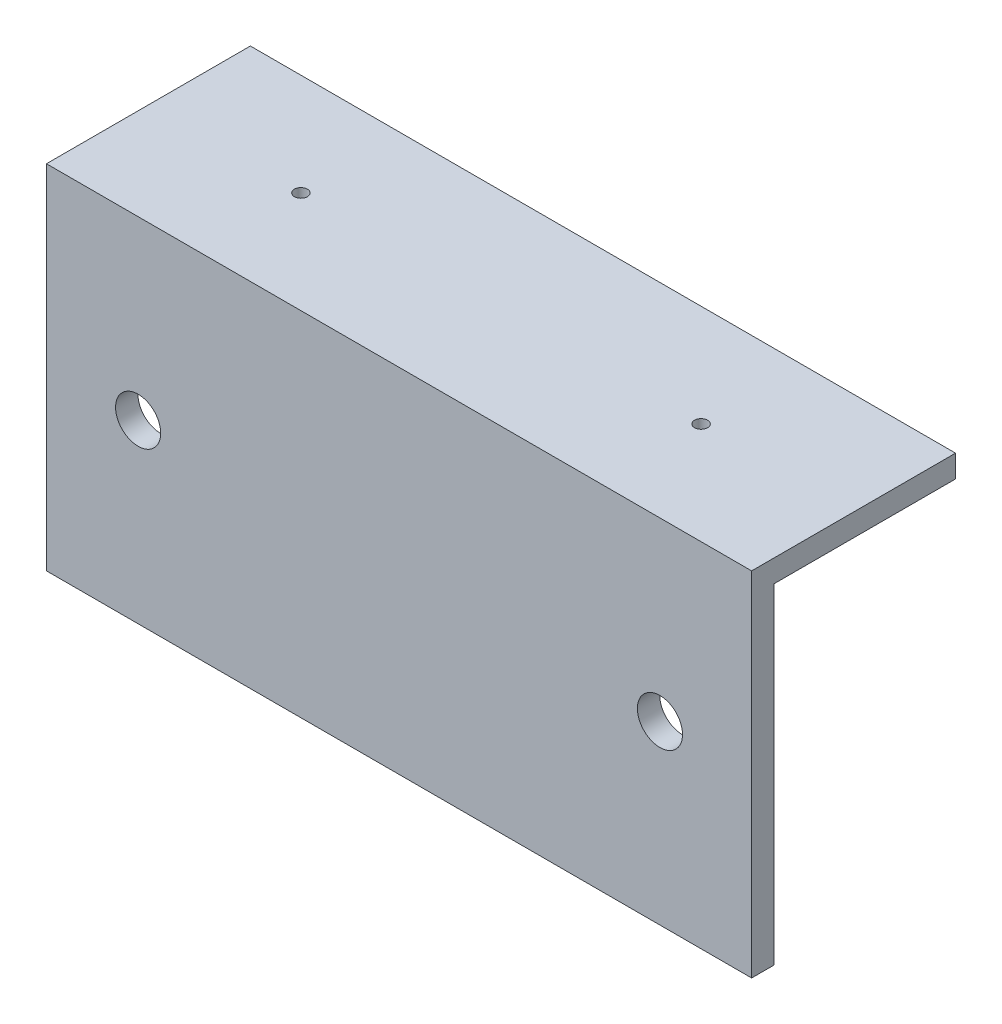
ISO-10303-21;
HEADER;
FILE_DESCRIPTION(('STEP AP214'),'2;1');
FILE_NAME('part.step','',(''),(''),'','','');
FILE_SCHEMA(('AUTOMOTIVE_DESIGN { 1 0 10303 214 1 1 1 1 }'));
ENDSEC;
DATA;
#1=APPLICATION_CONTEXT('core data for automotive mechanical design processes');
#2=APPLICATION_PROTOCOL_DEFINITION('international standard','automotive_design',2000,#1);
#3=PRODUCT_CONTEXT('',#1,'mechanical');
#4=PRODUCT('Part','Part','',(#3));
#5=PRODUCT_RELATED_PRODUCT_CATEGORY('part','',(#4));
#6=PRODUCT_DEFINITION_FORMATION('','',#4);
#7=PRODUCT_DEFINITION_CONTEXT('part definition',#1,'design');
#8=PRODUCT_DEFINITION('design','',#6,#7);
#9=PRODUCT_DEFINITION_SHAPE('','',#8);
#10=(LENGTH_UNIT() NAMED_UNIT(*) SI_UNIT(.MILLI.,.METRE.));
#11=(NAMED_UNIT(*) PLANE_ANGLE_UNIT() SI_UNIT($,.RADIAN.));
#12=(NAMED_UNIT(*) SI_UNIT($,.STERADIAN.) SOLID_ANGLE_UNIT());
#13=UNCERTAINTY_MEASURE_WITH_UNIT(LENGTH_MEASURE(1.E-05),#10,'distance_accuracy_value','');
#14=(GEOMETRIC_REPRESENTATION_CONTEXT(3) GLOBAL_UNCERTAINTY_ASSIGNED_CONTEXT((#13)) GLOBAL_UNIT_ASSIGNED_CONTEXT((#10,
#11,#12)) REPRESENTATION_CONTEXT('',''));
#15=CARTESIAN_POINT('',(0.,0.,0.));
#16=DIRECTION('',(0.,0.,1.));
#17=DIRECTION('',(1.,0.,0.));
#18=AXIS2_PLACEMENT_3D('',#15,#16,#17);
#19=CARTESIAN_POINT('',(25.,0.,1.5875));
#20=DIRECTION('',(-1.,0.,0.));
#21=DIRECTION('',(0.,0.,1.));
#22=AXIS2_PLACEMENT_3D('',#19,#20,#21);
#23=PLANE('',#22);
#24=DIRECTION('',(0.,1.,0.));
#25=VECTOR('',#24,1.);
#26=CARTESIAN_POINT('',(25.,0.,0.));
#27=LINE('',#26,#25);
#28=CARTESIAN_POINT('',(25.,-12.5,0.));
#29=VERTEX_POINT('',#28);
#30=CARTESIAN_POINT('',(25.,10.9125,0.));
#31=VERTEX_POINT('',#30);
#32=EDGE_CURVE('E117',#29,#31,#27,.T.);
#33=ORIENTED_EDGE('',*,*,#32,.T.);
#34=DIRECTION('',(0.,0.,-1.));
#35=VECTOR('',#34,1.);
#36=CARTESIAN_POINT('',(25.,10.9125,0.));
#37=LINE('',#36,#35);
#38=CARTESIAN_POINT('',(25.,10.9125,-12.8709783444627));
#39=VERTEX_POINT('',#38);
#40=EDGE_CURVE('E51',#31,#39,#37,.T.);
#41=ORIENTED_EDGE('',*,*,#40,.T.);
#42=DIRECTION('',(0.,1.,0.));
#43=VECTOR('',#42,1.);
#44=CARTESIAN_POINT('',(25.,10.9125,-12.8709783444627));
#45=LINE('',#44,#43);
#46=CARTESIAN_POINT('',(25.,12.5,-12.8709783444627));
#47=VERTEX_POINT('',#46);
#48=EDGE_CURVE('E100',#39,#47,#45,.T.);
#49=ORIENTED_EDGE('',*,*,#48,.T.);
#50=DIRECTION('',(0.,0.,-1.));
#51=VECTOR('',#50,1.);
#52=CARTESIAN_POINT('',(25.,12.5,1.5875));
#53=LINE('',#52,#51);
#54=CARTESIAN_POINT('',(25.,12.5,1.5875));
#55=VERTEX_POINT('',#54);
#56=EDGE_CURVE('E11',#55,#47,#53,.T.);
#57=ORIENTED_EDGE('',*,*,#56,.F.);
#58=DIRECTION('',(0.,1.,0.));
#59=VECTOR('',#58,1.);
#60=CARTESIAN_POINT('',(25.,0.,1.5875));
#61=LINE('',#60,#59);
#62=CARTESIAN_POINT('',(25.,-12.5,1.5875));
#63=VERTEX_POINT('',#62);
#64=EDGE_CURVE('E153',#63,#55,#61,.T.);
#65=ORIENTED_EDGE('',*,*,#64,.F.);
#66=DIRECTION('',(0.,0.,-1.));
#67=VECTOR('',#66,1.);
#68=CARTESIAN_POINT('',(25.,-12.5,1.5875));
#69=LINE('',#68,#67);
#70=EDGE_CURVE('E142',#63,#29,#69,.T.);
#71=ORIENTED_EDGE('',*,*,#70,.T.);
#72=EDGE_LOOP('',(#33,#41,#49,#57,#65,#71));
#73=FACE_BOUND('',#72,.T.);
#74=ADVANCED_FACE('F34',(#73),#23,.F.);
#75=CARTESIAN_POINT('',(0.,12.5,1.5875));
#76=DIRECTION('',(0.,-1.,0.));
#77=DIRECTION('',(0.,0.,-1.));
#78=AXIS2_PLACEMENT_3D('',#75,#76,#77);
#79=PLANE('',#78);
#80=CARTESIAN_POINT('',(-14.1859,12.5,-5.64173917223136));
#81=DIRECTION('',(0.,1.,0.));
#82=DIRECTION('',(0.,0.,1.));
#83=AXIS2_PLACEMENT_3D('',#80,#81,#82);
#84=CIRCLE('',#83,0.46355);
#85=CARTESIAN_POINT('',(-14.1859,12.5,-5.17818917223136));
#86=VERTEX_POINT('',#85);
#87=EDGE_CURVE('E215',#86,#86,#84,.T.);
#88=ORIENTED_EDGE('',*,*,#87,.F.);
#89=EDGE_LOOP('',(#88));
#90=FACE_BOUND('',#89,.T.);
#91=CARTESIAN_POINT('',(14.1859,12.5,-5.64173917223136));
#92=DIRECTION('',(0.,1.,0.));
#93=DIRECTION('',(0.,0.,1.));
#94=AXIS2_PLACEMENT_3D('',#91,#92,#93);
#95=CIRCLE('',#94,0.46355);
#96=CARTESIAN_POINT('',(14.1859,12.5,-5.17818917223136));
#97=VERTEX_POINT('',#96);
#98=EDGE_CURVE('E217',#97,#97,#95,.T.);
#99=ORIENTED_EDGE('',*,*,#98,.F.);
#100=EDGE_LOOP('',(#99));
#101=FACE_BOUND('',#100,.T.);
#102=ORIENTED_EDGE('',*,*,#56,.T.);
#103=DIRECTION('',(-1.,0.,0.));
#104=VECTOR('',#103,1.);
#105=CARTESIAN_POINT('',(25.,12.5,-12.8709783444627));
#106=LINE('',#105,#104);
#107=CARTESIAN_POINT('',(-25.,12.5,-12.8709783444627));
#108=VERTEX_POINT('',#107);
#109=EDGE_CURVE('E105',#47,#108,#106,.T.);
#110=ORIENTED_EDGE('',*,*,#109,.T.);
#111=DIRECTION('',(0.,0.,-1.));
#112=VECTOR('',#111,1.);
#113=CARTESIAN_POINT('',(-25.,12.5,1.5875));
#114=LINE('',#113,#112);
#115=CARTESIAN_POINT('',(-25.,12.5,1.5875));
#116=VERTEX_POINT('',#115);
#117=EDGE_CURVE('E43',#116,#108,#114,.T.);
#118=ORIENTED_EDGE('',*,*,#117,.F.);
#119=DIRECTION('',(-1.,0.,0.));
#120=VECTOR('',#119,1.);
#121=CARTESIAN_POINT('',(0.,12.5,1.5875));
#122=LINE('',#121,#120);
#123=EDGE_CURVE('E82',#55,#116,#122,.T.);
#124=ORIENTED_EDGE('',*,*,#123,.F.);
#125=EDGE_LOOP('',(#102,#110,#118,#124));
#126=FACE_BOUND('',#125,.T.);
#127=ADVANCED_FACE('F151',(#90,#101,#126),#79,.F.);
#128=CARTESIAN_POINT('',(-25.,0.,1.5875));
#129=DIRECTION('',(1.,0.,0.));
#130=DIRECTION('',(0.,0.,-1.));
#131=AXIS2_PLACEMENT_3D('',#128,#129,#130);
#132=PLANE('',#131);
#133=ORIENTED_EDGE('',*,*,#117,.T.);
#134=DIRECTION('',(0.,1.,0.));
#135=VECTOR('',#134,1.);
#136=CARTESIAN_POINT('',(-25.,10.9125,-12.8709783444627));
#137=LINE('',#136,#135);
#138=CARTESIAN_POINT('',(-25.,10.9125,-12.8709783444627));
#139=VERTEX_POINT('',#138);
#140=EDGE_CURVE('E108',#139,#108,#137,.T.);
#141=ORIENTED_EDGE('',*,*,#140,.F.);
#142=DIRECTION('',(0.,0.,1.));
#143=VECTOR('',#142,1.);
#144=CARTESIAN_POINT('',(-25.,10.9125,-12.8709783444627));
#145=LINE('',#144,#143);
#146=CARTESIAN_POINT('',(-25.,10.9125,0.));
#147=VERTEX_POINT('',#146);
#148=EDGE_CURVE('E113',#139,#147,#145,.T.);
#149=ORIENTED_EDGE('',*,*,#148,.T.);
#150=DIRECTION('',(0.,-1.,0.));
#151=VECTOR('',#150,1.);
#152=CARTESIAN_POINT('',(-25.,0.,0.));
#153=LINE('',#152,#151);
#154=CARTESIAN_POINT('',(-25.,-12.5,0.));
#155=VERTEX_POINT('',#154);
#156=EDGE_CURVE('E130',#147,#155,#153,.T.);
#157=ORIENTED_EDGE('',*,*,#156,.T.);
#158=DIRECTION('',(0.,0.,-1.));
#159=VECTOR('',#158,1.);
#160=CARTESIAN_POINT('',(-25.,-12.5,1.5875));
#161=LINE('',#160,#159);
#162=CARTESIAN_POINT('',(-25.,-12.5,1.5875));
#163=VERTEX_POINT('',#162);
#164=EDGE_CURVE('E144',#163,#155,#161,.T.);
#165=ORIENTED_EDGE('',*,*,#164,.F.);
#166=DIRECTION('',(0.,-1.,0.));
#167=VECTOR('',#166,1.);
#168=CARTESIAN_POINT('',(-25.,0.,1.5875));
#169=LINE('',#168,#167);
#170=EDGE_CURVE('E148',#116,#163,#169,.T.);
#171=ORIENTED_EDGE('',*,*,#170,.F.);
#172=EDGE_LOOP('',(#133,#141,#149,#157,#165,#171));
#173=FACE_BOUND('',#172,.T.);
#174=ADVANCED_FACE('F147',(#173),#132,.F.);
#175=CARTESIAN_POINT('',(-18.5,0.,1.5875));
#176=DIRECTION('',(0.,0.,-1.));
#177=DIRECTION('',(-1.,0.,0.));
#178=AXIS2_PLACEMENT_3D('',#175,#176,#177);
#179=CYLINDRICAL_SURFACE('',#178,1.6);
#180=CARTESIAN_POINT('',(-18.5,0.,1.5875));
#181=DIRECTION('',(0.,0.,1.));
#182=DIRECTION('',(1.,0.,0.));
#183=AXIS2_PLACEMENT_3D('',#180,#181,#182);
#184=CIRCLE('',#183,1.6);
#185=CARTESIAN_POINT('',(-16.9,0.,1.5875));
#186=VERTEX_POINT('',#185);
#187=EDGE_CURVE('E154',#186,#186,#184,.T.);
#188=ORIENTED_EDGE('',*,*,#187,.T.);
#189=EDGE_LOOP('',(#188));
#190=FACE_BOUND('',#189,.T.);
#191=CARTESIAN_POINT('',(-18.5,0.,0.));
#192=DIRECTION('',(0.,0.,1.));
#193=DIRECTION('',(1.,0.,0.));
#194=AXIS2_PLACEMENT_3D('',#191,#192,#193);
#195=CIRCLE('',#194,1.6);
#196=CARTESIAN_POINT('',(-16.9,0.,0.));
#197=VERTEX_POINT('',#196);
#198=EDGE_CURVE('E134',#197,#197,#195,.T.);
#199=ORIENTED_EDGE('',*,*,#198,.F.);
#200=EDGE_LOOP('',(#199));
#201=FACE_BOUND('',#200,.T.);
#202=ADVANCED_FACE('F168',(#190,#201),#179,.F.);
#203=CARTESIAN_POINT('',(18.5,0.,1.5875));
#204=DIRECTION('',(0.,0.,-1.));
#205=DIRECTION('',(-1.,0.,0.));
#206=AXIS2_PLACEMENT_3D('',#203,#204,#205);
#207=CYLINDRICAL_SURFACE('',#206,1.6);
#208=CARTESIAN_POINT('',(18.5,0.,1.5875));
#209=DIRECTION('',(0.,0.,1.));
#210=DIRECTION('',(1.,0.,0.));
#211=AXIS2_PLACEMENT_3D('',#208,#209,#210);
#212=CIRCLE('',#211,1.6);
#213=CARTESIAN_POINT('',(20.1,0.,1.5875));
#214=VERTEX_POINT('',#213);
#215=EDGE_CURVE('E132',#214,#214,#212,.T.);
#216=ORIENTED_EDGE('',*,*,#215,.T.);
#217=EDGE_LOOP('',(#216));
#218=FACE_BOUND('',#217,.T.);
#219=CARTESIAN_POINT('',(18.5,0.,0.));
#220=DIRECTION('',(0.,0.,1.));
#221=DIRECTION('',(1.,0.,0.));
#222=AXIS2_PLACEMENT_3D('',#219,#220,#221);
#223=CIRCLE('',#222,1.6);
#224=CARTESIAN_POINT('',(20.1,0.,0.));
#225=VERTEX_POINT('',#224);
#226=EDGE_CURVE('E149',#225,#225,#223,.T.);
#227=ORIENTED_EDGE('',*,*,#226,.F.);
#228=EDGE_LOOP('',(#227));
#229=FACE_BOUND('',#228,.T.);
#230=ADVANCED_FACE('F36',(#218,#229),#207,.F.);
#231=CARTESIAN_POINT('',(0.,-12.5,1.5875));
#232=DIRECTION('',(0.,1.,0.));
#233=DIRECTION('',(0.,0.,1.));
#234=AXIS2_PLACEMENT_3D('',#231,#232,#233);
#235=PLANE('',#234);
#236=DIRECTION('',(1.,0.,0.));
#237=VECTOR('',#236,1.);
#238=CARTESIAN_POINT('',(0.,-12.5,0.));
#239=LINE('',#238,#237);
#240=EDGE_CURVE('E75',#155,#29,#239,.T.);
#241=ORIENTED_EDGE('',*,*,#240,.T.);
#242=ORIENTED_EDGE('',*,*,#70,.F.);
#243=DIRECTION('',(1.,0.,0.));
#244=VECTOR('',#243,1.);
#245=CARTESIAN_POINT('',(0.,-12.5,1.5875));
#246=LINE('',#245,#244);
#247=EDGE_CURVE('E60',#163,#63,#246,.T.);
#248=ORIENTED_EDGE('',*,*,#247,.F.);
#249=ORIENTED_EDGE('',*,*,#164,.T.);
#250=EDGE_LOOP('',(#241,#242,#248,#249));
#251=FACE_BOUND('',#250,.T.);
#252=ADVANCED_FACE('F175',(#251),#235,.F.);
#253=CARTESIAN_POINT('',(0.,0.,1.5875));
#254=DIRECTION('',(0.,0.,1.));
#255=DIRECTION('',(1.,0.,0.));
#256=AXIS2_PLACEMENT_3D('',#253,#254,#255);
#257=PLANE('',#256);
#258=ORIENTED_EDGE('',*,*,#215,.F.);
#259=EDGE_LOOP('',(#258));
#260=FACE_BOUND('',#259,.T.);
#261=ORIENTED_EDGE('',*,*,#187,.F.);
#262=EDGE_LOOP('',(#261));
#263=FACE_BOUND('',#262,.T.);
#264=ORIENTED_EDGE('',*,*,#64,.T.);
#265=ORIENTED_EDGE('',*,*,#123,.T.);
#266=ORIENTED_EDGE('',*,*,#170,.T.);
#267=ORIENTED_EDGE('',*,*,#247,.T.);
#268=EDGE_LOOP('',(#264,#265,#266,#267));
#269=FACE_BOUND('',#268,.T.);
#270=ADVANCED_FACE('F188',(#260,#263,#269),#257,.T.);
#271=CARTESIAN_POINT('',(0.,0.,0.));
#272=DIRECTION('',(0.,0.,1.));
#273=DIRECTION('',(1.,0.,0.));
#274=AXIS2_PLACEMENT_3D('',#271,#272,#273);
#275=PLANE('',#274);
#276=ORIENTED_EDGE('',*,*,#226,.T.);
#277=EDGE_LOOP('',(#276));
#278=FACE_BOUND('',#277,.T.);
#279=ORIENTED_EDGE('',*,*,#198,.T.);
#280=EDGE_LOOP('',(#279));
#281=FACE_BOUND('',#280,.T.);
#282=ORIENTED_EDGE('',*,*,#156,.F.);
#283=DIRECTION('',(1.,0.,0.));
#284=VECTOR('',#283,1.);
#285=CARTESIAN_POINT('',(-25.,10.9125,0.));
#286=LINE('',#285,#284);
#287=EDGE_CURVE('E109',#147,#31,#286,.T.);
#288=ORIENTED_EDGE('',*,*,#287,.T.);
#289=ORIENTED_EDGE('',*,*,#32,.F.);
#290=ORIENTED_EDGE('',*,*,#240,.F.);
#291=EDGE_LOOP('',(#282,#288,#289,#290));
#292=FACE_BOUND('',#291,.T.);
#293=ADVANCED_FACE('F129',(#278,#281,#292),#275,.F.);
#294=CARTESIAN_POINT('',(25.,10.9125,-12.8709783444627));
#295=DIRECTION('',(0.,0.,-1.));
#296=DIRECTION('',(-1.,0.,0.));
#297=AXIS2_PLACEMENT_3D('',#294,#295,#296);
#298=PLANE('',#297);
#299=ORIENTED_EDGE('',*,*,#109,.F.);
#300=ORIENTED_EDGE('',*,*,#48,.F.);
#301=DIRECTION('',(-1.,0.,0.));
#302=VECTOR('',#301,1.);
#303=CARTESIAN_POINT('',(25.,10.9125,-12.8709783444627));
#304=LINE('',#303,#302);
#305=EDGE_CURVE('E103',#39,#139,#304,.T.);
#306=ORIENTED_EDGE('',*,*,#305,.T.);
#307=ORIENTED_EDGE('',*,*,#140,.T.);
#308=EDGE_LOOP('',(#299,#300,#306,#307));
#309=FACE_BOUND('',#308,.T.);
#310=ADVANCED_FACE('F101',(#309),#298,.T.);
#311=CARTESIAN_POINT('',(0.,10.9125,0.));
#312=DIRECTION('',(0.,1.,0.));
#313=DIRECTION('',(0.,0.,1.));
#314=AXIS2_PLACEMENT_3D('',#311,#312,#313);
#315=PLANE('',#314);
#316=CARTESIAN_POINT('',(-14.1859,10.9125,-5.64173917223136));
#317=DIRECTION('',(0.,1.,0.));
#318=DIRECTION('',(0.,0.,1.));
#319=AXIS2_PLACEMENT_3D('',#316,#317,#318);
#320=CIRCLE('',#319,0.46355);
#321=CARTESIAN_POINT('',(-14.1859,10.9125,-5.17818917223136));
#322=VERTEX_POINT('',#321);
#323=EDGE_CURVE('E212',#322,#322,#320,.T.);
#324=ORIENTED_EDGE('',*,*,#323,.T.);
#325=EDGE_LOOP('',(#324));
#326=FACE_BOUND('',#325,.T.);
#327=CARTESIAN_POINT('',(14.1859,10.9125,-5.64173917223136));
#328=DIRECTION('',(0.,1.,0.));
#329=DIRECTION('',(0.,0.,1.));
#330=AXIS2_PLACEMENT_3D('',#327,#328,#329);
#331=CIRCLE('',#330,0.46355);
#332=CARTESIAN_POINT('',(14.1859,10.9125,-5.17818917223136));
#333=VERTEX_POINT('',#332);
#334=EDGE_CURVE('E119',#333,#333,#331,.T.);
#335=ORIENTED_EDGE('',*,*,#334,.T.);
#336=EDGE_LOOP('',(#335));
#337=FACE_BOUND('',#336,.T.);
#338=ORIENTED_EDGE('',*,*,#40,.F.);
#339=ORIENTED_EDGE('',*,*,#287,.F.);
#340=ORIENTED_EDGE('',*,*,#148,.F.);
#341=ORIENTED_EDGE('',*,*,#305,.F.);
#342=EDGE_LOOP('',(#338,#339,#340,#341));
#343=FACE_BOUND('',#342,.T.);
#344=ADVANCED_FACE('F112',(#326,#337,#343),#315,.F.);
#345=CARTESIAN_POINT('',(14.1859,10.9125,-5.64173917223136));
#346=DIRECTION('',(0.,1.,0.));
#347=DIRECTION('',(0.,0.,1.));
#348=AXIS2_PLACEMENT_3D('',#345,#346,#347);
#349=CYLINDRICAL_SURFACE('',#348,0.46355);
#350=ORIENTED_EDGE('',*,*,#334,.F.);
#351=EDGE_LOOP('',(#350));
#352=FACE_BOUND('',#351,.T.);
#353=ORIENTED_EDGE('',*,*,#98,.T.);
#354=EDGE_LOOP('',(#353));
#355=FACE_BOUND('',#354,.T.);
#356=ADVANCED_FACE('F199',(#352,#355),#349,.F.);
#357=CARTESIAN_POINT('',(-14.1859,10.9125,-5.64173917223136));
#358=DIRECTION('',(0.,1.,0.));
#359=DIRECTION('',(0.,0.,1.));
#360=AXIS2_PLACEMENT_3D('',#357,#358,#359);
#361=CYLINDRICAL_SURFACE('',#360,0.46355);
#362=ORIENTED_EDGE('',*,*,#323,.F.);
#363=EDGE_LOOP('',(#362));
#364=FACE_BOUND('',#363,.T.);
#365=ORIENTED_EDGE('',*,*,#87,.T.);
#366=EDGE_LOOP('',(#365));
#367=FACE_BOUND('',#366,.T.);
#368=ADVANCED_FACE('F203',(#364,#367),#361,.F.);
#369=CLOSED_SHELL('',(#74,#127,#174,#202,#230,#252,#270,#293,#310,#344,#356,#368));
#370=MANIFOLD_SOLID_BREP('B2',#369);
#371=ADVANCED_BREP_SHAPE_REPRESENTATION('',(#18,#370),#14);
#372=SHAPE_DEFINITION_REPRESENTATION(#9,#371);
ENDSEC;
END-ISO-10303-21;
